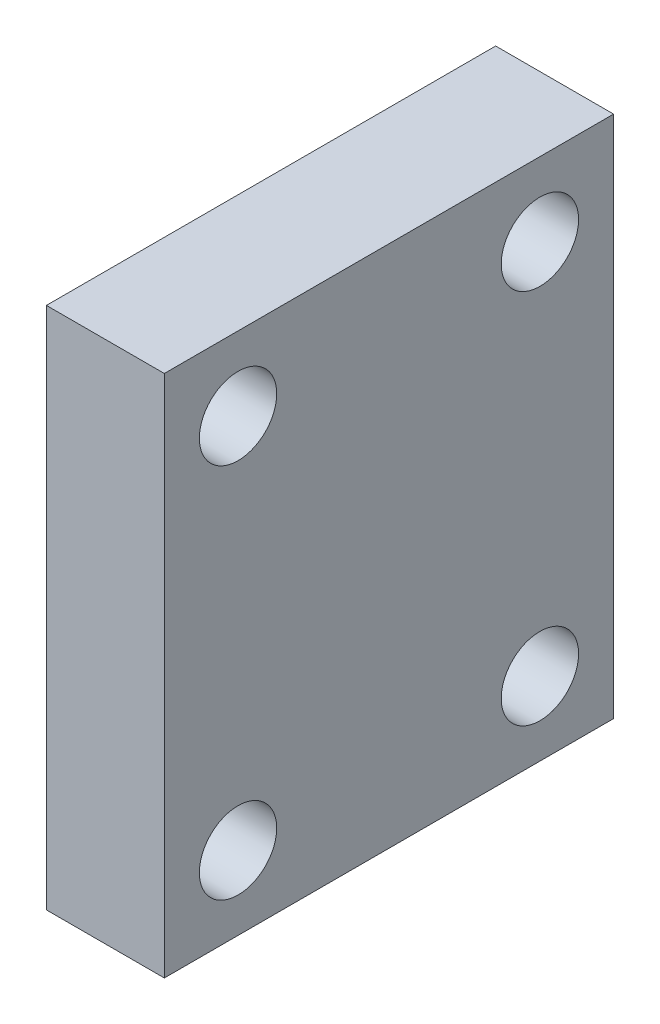
ISO-10303-21;
HEADER;
FILE_DESCRIPTION(('STEP AP214'),'2;1');
FILE_NAME('part.step','',(''),(''),'','','');
FILE_SCHEMA(('AUTOMOTIVE_DESIGN { 1 0 10303 214 1 1 1 1 }'));
ENDSEC;
DATA;
#1=APPLICATION_CONTEXT('core data for automotive mechanical design processes');
#2=APPLICATION_PROTOCOL_DEFINITION('international standard','automotive_design',2000,#1);
#3=PRODUCT_CONTEXT('',#1,'mechanical');
#4=PRODUCT('Part','Part','',(#3));
#5=PRODUCT_RELATED_PRODUCT_CATEGORY('part','',(#4));
#6=PRODUCT_DEFINITION_FORMATION('','',#4);
#7=PRODUCT_DEFINITION_CONTEXT('part definition',#1,'design');
#8=PRODUCT_DEFINITION('design','',#6,#7);
#9=PRODUCT_DEFINITION_SHAPE('','',#8);
#10=(LENGTH_UNIT() NAMED_UNIT(*) SI_UNIT(.MILLI.,.METRE.));
#11=(NAMED_UNIT(*) PLANE_ANGLE_UNIT() SI_UNIT($,.RADIAN.));
#12=(NAMED_UNIT(*) SI_UNIT($,.STERADIAN.) SOLID_ANGLE_UNIT());
#13=UNCERTAINTY_MEASURE_WITH_UNIT(LENGTH_MEASURE(1.E-05),#10,'distance_accuracy_value','');
#14=(GEOMETRIC_REPRESENTATION_CONTEXT(3) GLOBAL_UNCERTAINTY_ASSIGNED_CONTEXT((#13)) GLOBAL_UNIT_ASSIGNED_CONTEXT((#10,
#11,#12)) REPRESENTATION_CONTEXT('',''));
#15=CARTESIAN_POINT('',(0.,0.,0.));
#16=DIRECTION('',(0.,0.,1.));
#17=DIRECTION('',(1.,0.,0.));
#18=AXIS2_PLACEMENT_3D('',#15,#16,#17);
#19=CARTESIAN_POINT('',(12.7,74.549,48.387));
#20=DIRECTION('',(-1.,0.,0.));
#21=DIRECTION('',(0.,0.,1.));
#22=AXIS2_PLACEMENT_3D('',#19,#20,#21);
#23=CYLINDRICAL_SURFACE('',#22,11.509375);
#24=CARTESIAN_POINT('',(2.8194,74.549,48.387));
#25=DIRECTION('',(1.,0.,0.));
#26=DIRECTION('',(0.,0.,-1.));
#27=AXIS2_PLACEMENT_3D('',#24,#25,#26);
#28=CIRCLE('',#27,11.509375);
#29=CARTESIAN_POINT('',(2.8194,71.8767199958881,37.1921515208892));
#30=VERTEX_POINT('',#29);
#31=CARTESIAN_POINT('',(2.8194,79.375,37.9382949658522));
#32=VERTEX_POINT('',#31);
#33=EDGE_CURVE('E61',#30,#32,#28,.T.);
#34=ORIENTED_EDGE('',*,*,#33,.F.);
#35=DIRECTION('',(-1.,0.,0.));
#36=VECTOR('',#35,1.);
#37=CARTESIAN_POINT('',(1.4097,71.8767199958881,37.1921515208892));
#38=LINE('',#37,#36);
#39=CARTESIAN_POINT('',(0.,71.8767199958881,37.1921515208892));
#40=VERTEX_POINT('',#39);
#41=EDGE_CURVE('E138',#30,#40,#38,.T.);
#42=ORIENTED_EDGE('',*,*,#41,.T.);
#43=CARTESIAN_POINT('',(0.,74.549,48.387));
#44=DIRECTION('',(1.,0.,0.));
#45=DIRECTION('',(0.,0.,-1.));
#46=AXIS2_PLACEMENT_3D('',#43,#44,#45);
#47=CIRCLE('',#46,11.509375);
#48=CARTESIAN_POINT('',(0.,71.8767199958881,59.5818484791108));
#49=VERTEX_POINT('',#48);
#50=EDGE_CURVE('E144',#49,#40,#47,.T.);
#51=ORIENTED_EDGE('',*,*,#50,.F.);
#52=DIRECTION('',(-1.,0.,0.));
#53=VECTOR('',#52,1.);
#54=CARTESIAN_POINT('',(1.4097,71.8767199958881,59.5818484791108));
#55=LINE('',#54,#53);
#56=CARTESIAN_POINT('',(2.8194,71.8767199958881,59.5818484791108));
#57=VERTEX_POINT('',#56);
#58=EDGE_CURVE('E129',#49,#57,#55,.F.);
#59=ORIENTED_EDGE('',*,*,#58,.T.);
#60=CARTESIAN_POINT('',(2.8194,79.375,58.8357050341478));
#61=VERTEX_POINT('',#60);
#62=EDGE_CURVE('E212',#61,#57,#28,.T.);
#63=ORIENTED_EDGE('',*,*,#62,.F.);
#64=DIRECTION('',(-1.,0.,0.));
#65=VECTOR('',#64,1.);
#66=CARTESIAN_POINT('',(6.35,79.375,58.8357050341478));
#67=LINE('',#66,#65);
#68=CARTESIAN_POINT('',(12.7,79.375,58.8357050341478));
#69=VERTEX_POINT('',#68);
#70=EDGE_CURVE('E217',#61,#69,#67,.F.);
#71=ORIENTED_EDGE('',*,*,#70,.T.);
#72=CARTESIAN_POINT('',(12.7,74.549,48.387));
#73=DIRECTION('',(1.,0.,0.));
#74=DIRECTION('',(0.,0.,-1.));
#75=AXIS2_PLACEMENT_3D('',#72,#73,#74);
#76=CIRCLE('',#75,11.509375);
#77=CARTESIAN_POINT('',(12.7,79.375,37.9382949658522));
#78=VERTEX_POINT('',#77);
#79=EDGE_CURVE('E148',#69,#78,#76,.T.);
#80=ORIENTED_EDGE('',*,*,#79,.T.);
#81=DIRECTION('',(-1.,0.,0.));
#82=VECTOR('',#81,1.);
#83=CARTESIAN_POINT('',(6.35,79.375,37.9382949658522));
#84=LINE('',#83,#82);
#85=EDGE_CURVE('E154',#78,#32,#84,.T.);
#86=ORIENTED_EDGE('',*,*,#85,.T.);
#87=EDGE_LOOP('',(#34,#42,#51,#59,#63,#71,#80,#86));
#88=FACE_BOUND('',#87,.T.);
#89=ADVANCED_FACE('F39',(#88),#23,.F.);
#90=CARTESIAN_POINT('',(12.7,28.575,48.387));
#91=DIRECTION('',(-1.,0.,0.));
#92=DIRECTION('',(0.,0.,1.));
#93=AXIS2_PLACEMENT_3D('',#90,#91,#92);
#94=CYLINDRICAL_SURFACE('',#93,11.509375);
#95=CARTESIAN_POINT('',(2.8194,28.575,48.387));
#96=DIRECTION('',(1.,0.,0.));
#97=DIRECTION('',(0.,0.,-1.));
#98=AXIS2_PLACEMENT_3D('',#95,#96,#97);
#99=CIRCLE('',#98,11.509375);
#100=CARTESIAN_POINT('',(2.8194,25.9027199958881,37.1921515208892));
#101=VERTEX_POINT('',#100);
#102=CARTESIAN_POINT('',(2.8194,33.401,37.9382949658522));
#103=VERTEX_POINT('',#102);
#104=EDGE_CURVE('E53',#101,#103,#99,.T.);
#105=ORIENTED_EDGE('',*,*,#104,.F.);
#106=DIRECTION('',(-1.,0.,0.));
#107=VECTOR('',#106,1.);
#108=CARTESIAN_POINT('',(1.4097,25.9027199958881,37.1921515208892));
#109=LINE('',#108,#107);
#110=CARTESIAN_POINT('',(0.,25.9027199958881,37.1921515208892));
#111=VERTEX_POINT('',#110);
#112=EDGE_CURVE('E256',#101,#111,#109,.T.);
#113=ORIENTED_EDGE('',*,*,#112,.T.);
#114=CARTESIAN_POINT('',(0.,28.575,48.387));
#115=DIRECTION('',(1.,0.,0.));
#116=DIRECTION('',(0.,0.,-1.));
#117=AXIS2_PLACEMENT_3D('',#114,#115,#116);
#118=CIRCLE('',#117,11.509375);
#119=CARTESIAN_POINT('',(0.,25.9027199958881,59.5818484791108));
#120=VERTEX_POINT('',#119);
#121=EDGE_CURVE('E147',#120,#111,#118,.T.);
#122=ORIENTED_EDGE('',*,*,#121,.F.);
#123=DIRECTION('',(-1.,0.,0.));
#124=VECTOR('',#123,1.);
#125=CARTESIAN_POINT('',(1.4097,25.9027199958881,59.5818484791108));
#126=LINE('',#125,#124);
#127=CARTESIAN_POINT('',(2.8194,25.9027199958881,59.5818484791108));
#128=VERTEX_POINT('',#127);
#129=EDGE_CURVE('E250',#120,#128,#126,.F.);
#130=ORIENTED_EDGE('',*,*,#129,.T.);
#131=CARTESIAN_POINT('',(2.8194,33.401,58.8357050341478));
#132=VERTEX_POINT('',#131);
#133=EDGE_CURVE('E246',#132,#128,#99,.T.);
#134=ORIENTED_EDGE('',*,*,#133,.F.);
#135=DIRECTION('',(-1.,0.,0.));
#136=VECTOR('',#135,1.);
#137=CARTESIAN_POINT('',(6.35,33.401,58.8357050341478));
#138=LINE('',#137,#136);
#139=CARTESIAN_POINT('',(12.7,33.401,58.8357050341478));
#140=VERTEX_POINT('',#139);
#141=EDGE_CURVE('E228',#132,#140,#138,.F.);
#142=ORIENTED_EDGE('',*,*,#141,.T.);
#143=CARTESIAN_POINT('',(12.7,28.575,48.387));
#144=DIRECTION('',(1.,0.,0.));
#145=DIRECTION('',(0.,0.,-1.));
#146=AXIS2_PLACEMENT_3D('',#143,#144,#145);
#147=CIRCLE('',#146,11.509375);
#148=CARTESIAN_POINT('',(12.7,33.401,37.9382949658522));
#149=VERTEX_POINT('',#148);
#150=EDGE_CURVE('E151',#140,#149,#147,.T.);
#151=ORIENTED_EDGE('',*,*,#150,.T.);
#152=DIRECTION('',(-1.,0.,0.));
#153=VECTOR('',#152,1.);
#154=CARTESIAN_POINT('',(6.35,33.401,37.9382949658522));
#155=LINE('',#154,#153);
#156=EDGE_CURVE('E224',#149,#103,#155,.T.);
#157=ORIENTED_EDGE('',*,*,#156,.T.);
#158=EDGE_LOOP('',(#105,#113,#122,#130,#134,#142,#151,#157));
#159=FACE_BOUND('',#158,.T.);
#160=ADVANCED_FACE('F234',(#159),#94,.F.);
#161=CARTESIAN_POINT('',(25.4,0.,0.));
#162=DIRECTION('',(0.,1.,0.));
#163=DIRECTION('',(0.,0.,1.));
#164=AXIS2_PLACEMENT_3D('',#161,#162,#163);
#165=PLANE('',#164);
#166=DIRECTION('',(0.,0.,-1.));
#167=VECTOR('',#166,1.);
#168=CARTESIAN_POINT('',(0.,0.,0.));
#169=LINE('',#168,#167);
#170=CARTESIAN_POINT('',(0.,0.,96.774));
#171=VERTEX_POINT('',#170);
#172=CARTESIAN_POINT('',(0.,0.,0.));
#173=VERTEX_POINT('',#172);
#174=EDGE_CURVE('E180',#171,#173,#169,.T.);
#175=ORIENTED_EDGE('',*,*,#174,.T.);
#176=DIRECTION('',(-1.,0.,0.));
#177=VECTOR('',#176,1.);
#178=CARTESIAN_POINT('',(25.4,0.,0.));
#179=LINE('',#178,#177);
#180=CARTESIAN_POINT('',(25.4,0.,0.));
#181=VERTEX_POINT('',#180);
#182=EDGE_CURVE('E209',#181,#173,#179,.T.);
#183=ORIENTED_EDGE('',*,*,#182,.F.);
#184=DIRECTION('',(0.,0.,-1.));
#185=VECTOR('',#184,1.);
#186=CARTESIAN_POINT('',(25.4,0.,0.));
#187=LINE('',#186,#185);
#188=CARTESIAN_POINT('',(25.4,0.,96.774));
#189=VERTEX_POINT('',#188);
#190=EDGE_CURVE('E183',#189,#181,#187,.T.);
#191=ORIENTED_EDGE('',*,*,#190,.F.);
#192=DIRECTION('',(-1.,0.,0.));
#193=VECTOR('',#192,1.);
#194=CARTESIAN_POINT('',(25.4,0.,96.774));
#195=LINE('',#194,#193);
#196=EDGE_CURVE('E193',#189,#171,#195,.T.);
#197=ORIENTED_EDGE('',*,*,#196,.T.);
#198=EDGE_LOOP('',(#175,#183,#191,#197));
#199=FACE_BOUND('',#198,.T.);
#200=ADVANCED_FACE('F41',(#199),#165,.F.);
#201=CARTESIAN_POINT('',(25.4,0.,0.));
#202=DIRECTION('',(0.,0.,1.));
#203=DIRECTION('',(1.,0.,0.));
#204=AXIS2_PLACEMENT_3D('',#201,#202,#203);
#205=PLANE('',#204);
#206=DIRECTION('',(0.,1.,0.));
#207=VECTOR('',#206,1.);
#208=CARTESIAN_POINT('',(0.,0.,0.));
#209=LINE('',#208,#207);
#210=CARTESIAN_POINT('',(0.,112.776,0.));
#211=VERTEX_POINT('',#210);
#212=EDGE_CURVE('E196',#173,#211,#209,.T.);
#213=ORIENTED_EDGE('',*,*,#212,.T.);
#214=DIRECTION('',(-1.,0.,0.));
#215=VECTOR('',#214,1.);
#216=CARTESIAN_POINT('',(25.4,112.776,0.));
#217=LINE('',#216,#215);
#218=CARTESIAN_POINT('',(25.4,112.776,0.));
#219=VERTEX_POINT('',#218);
#220=EDGE_CURVE('E206',#219,#211,#217,.T.);
#221=ORIENTED_EDGE('',*,*,#220,.F.);
#222=DIRECTION('',(0.,1.,0.));
#223=VECTOR('',#222,1.);
#224=CARTESIAN_POINT('',(25.4,0.,0.));
#225=LINE('',#224,#223);
#226=EDGE_CURVE('E186',#181,#219,#225,.T.);
#227=ORIENTED_EDGE('',*,*,#226,.F.);
#228=ORIENTED_EDGE('',*,*,#182,.T.);
#229=EDGE_LOOP('',(#213,#221,#227,#228));
#230=FACE_BOUND('',#229,.T.);
#231=ADVANCED_FACE('F356',(#230),#205,.F.);
#232=CARTESIAN_POINT('',(25.4,112.776,0.));
#233=DIRECTION('',(0.,-1.,0.));
#234=DIRECTION('',(0.,0.,-1.));
#235=AXIS2_PLACEMENT_3D('',#232,#233,#234);
#236=PLANE('',#235);
#237=DIRECTION('',(0.,0.,1.));
#238=VECTOR('',#237,1.);
#239=CARTESIAN_POINT('',(0.,112.776,0.));
#240=LINE('',#239,#238);
#241=CARTESIAN_POINT('',(0.,112.776,96.774));
#242=VERTEX_POINT('',#241);
#243=EDGE_CURVE('E198',#211,#242,#240,.T.);
#244=ORIENTED_EDGE('',*,*,#243,.T.);
#245=DIRECTION('',(-1.,0.,0.));
#246=VECTOR('',#245,1.);
#247=CARTESIAN_POINT('',(25.4,112.776,96.774));
#248=LINE('',#247,#246);
#249=CARTESIAN_POINT('',(25.4,112.776,96.774));
#250=VERTEX_POINT('',#249);
#251=EDGE_CURVE('E203',#250,#242,#248,.T.);
#252=ORIENTED_EDGE('',*,*,#251,.F.);
#253=DIRECTION('',(0.,0.,1.));
#254=VECTOR('',#253,1.);
#255=CARTESIAN_POINT('',(25.4,112.776,0.));
#256=LINE('',#255,#254);
#257=EDGE_CURVE('E189',#219,#250,#256,.T.);
#258=ORIENTED_EDGE('',*,*,#257,.F.);
#259=ORIENTED_EDGE('',*,*,#220,.T.);
#260=EDGE_LOOP('',(#244,#252,#258,#259));
#261=FACE_BOUND('',#260,.T.);
#262=ADVANCED_FACE('F353',(#261),#236,.F.);
#263=CARTESIAN_POINT('',(25.4,0.,96.774));
#264=DIRECTION('',(0.,0.,-1.));
#265=DIRECTION('',(-1.,0.,0.));
#266=AXIS2_PLACEMENT_3D('',#263,#264,#265);
#267=PLANE('',#266);
#268=DIRECTION('',(0.,-1.,0.));
#269=VECTOR('',#268,1.);
#270=CARTESIAN_POINT('',(0.,0.,96.774));
#271=LINE('',#270,#269);
#272=EDGE_CURVE('E187',#242,#171,#271,.T.);
#273=ORIENTED_EDGE('',*,*,#272,.T.);
#274=ORIENTED_EDGE('',*,*,#196,.F.);
#275=DIRECTION('',(0.,-1.,0.));
#276=VECTOR('',#275,1.);
#277=CARTESIAN_POINT('',(25.4,0.,96.774));
#278=LINE('',#277,#276);
#279=EDGE_CURVE('E191',#250,#189,#278,.T.);
#280=ORIENTED_EDGE('',*,*,#279,.F.);
#281=ORIENTED_EDGE('',*,*,#251,.T.);
#282=EDGE_LOOP('',(#273,#274,#280,#281));
#283=FACE_BOUND('',#282,.T.);
#284=ADVANCED_FACE('F346',(#283),#267,.F.);
#285=CARTESIAN_POINT('',(25.4,0.,0.));
#286=DIRECTION('',(-1.,0.,0.));
#287=DIRECTION('',(0.,0.,1.));
#288=AXIS2_PLACEMENT_3D('',#285,#286,#287);
#289=PLANE('',#288);
#290=CARTESIAN_POINT('',(25.4,96.901,15.875));
#291=DIRECTION('',(1.,0.,0.));
#292=DIRECTION('',(0.,0.,-1.));
#293=AXIS2_PLACEMENT_3D('',#290,#291,#292);
#294=CIRCLE('',#293,8.334375);
#295=CARTESIAN_POINT('',(25.4,96.901,7.540625));
#296=VERTEX_POINT('',#295);
#297=EDGE_CURVE('E169',#296,#296,#294,.T.);
#298=ORIENTED_EDGE('',*,*,#297,.F.);
#299=EDGE_LOOP('',(#298));
#300=FACE_BOUND('',#299,.T.);
#301=CARTESIAN_POINT('',(25.4,15.875,80.899));
#302=DIRECTION('',(1.,0.,0.));
#303=DIRECTION('',(0.,0.,-1.));
#304=AXIS2_PLACEMENT_3D('',#301,#302,#303);
#305=CIRCLE('',#304,8.334375);
#306=CARTESIAN_POINT('',(25.4,15.875,72.564625));
#307=VERTEX_POINT('',#306);
#308=EDGE_CURVE('E161',#307,#307,#305,.T.);
#309=ORIENTED_EDGE('',*,*,#308,.F.);
#310=EDGE_LOOP('',(#309));
#311=FACE_BOUND('',#310,.T.);
#312=CARTESIAN_POINT('',(25.4,96.901,80.899));
#313=DIRECTION('',(1.,0.,0.));
#314=DIRECTION('',(0.,0.,-1.));
#315=AXIS2_PLACEMENT_3D('',#312,#313,#314);
#316=CIRCLE('',#315,8.33437500000001);
#317=CARTESIAN_POINT('',(25.4,96.901,72.564625));
#318=VERTEX_POINT('',#317);
#319=EDGE_CURVE('E162',#318,#318,#316,.T.);
#320=ORIENTED_EDGE('',*,*,#319,.F.);
#321=EDGE_LOOP('',(#320));
#322=FACE_BOUND('',#321,.T.);
#323=CARTESIAN_POINT('',(25.4,15.875,15.875));
#324=DIRECTION('',(1.,0.,0.));
#325=DIRECTION('',(0.,0.,-1.));
#326=AXIS2_PLACEMENT_3D('',#323,#324,#325);
#327=CIRCLE('',#326,8.334375);
#328=CARTESIAN_POINT('',(25.4,15.875,7.540625));
#329=VERTEX_POINT('',#328);
#330=EDGE_CURVE('E177',#329,#329,#327,.T.);
#331=ORIENTED_EDGE('',*,*,#330,.F.);
#332=EDGE_LOOP('',(#331));
#333=FACE_BOUND('',#332,.T.);
#334=ORIENTED_EDGE('',*,*,#190,.T.);
#335=ORIENTED_EDGE('',*,*,#226,.T.);
#336=ORIENTED_EDGE('',*,*,#257,.T.);
#337=ORIENTED_EDGE('',*,*,#279,.T.);
#338=EDGE_LOOP('',(#334,#335,#336,#337));
#339=FACE_BOUND('',#338,.T.);
#340=ADVANCED_FACE('F343',(#300,#311,#322,#333,#339),#289,.F.);
#341=CARTESIAN_POINT('',(0.,0.,0.));
#342=DIRECTION('',(-1.,0.,0.));
#343=DIRECTION('',(0.,0.,1.));
#344=AXIS2_PLACEMENT_3D('',#341,#342,#343);
#345=PLANE('',#344);
#346=CARTESIAN_POINT('',(0.,7.239,48.387));
#347=DIRECTION('',(1.,0.,0.));
#348=DIRECTION('',(0.,0.,-1.));
#349=AXIS2_PLACEMENT_3D('',#346,#347,#348);
#350=CIRCLE('',#349,3.175);
#351=CARTESIAN_POINT('',(0.,7.239,45.212));
#352=VERTEX_POINT('',#351);
#353=EDGE_CURVE('E285',#352,#352,#350,.T.);
#354=ORIENTED_EDGE('',*,*,#353,.T.);
#355=EDGE_LOOP('',(#354));
#356=FACE_BOUND('',#355,.T.);
#357=CARTESIAN_POINT('',(0.,56.261,80.899));
#358=DIRECTION('',(1.,0.,0.));
#359=DIRECTION('',(0.,0.,-1.));
#360=AXIS2_PLACEMENT_3D('',#357,#358,#359);
#361=CIRCLE('',#360,3.175);
#362=CARTESIAN_POINT('',(0.,56.261,77.724));
#363=VERTEX_POINT('',#362);
#364=EDGE_CURVE('E290',#363,#363,#361,.T.);
#365=ORIENTED_EDGE('',*,*,#364,.T.);
#366=EDGE_LOOP('',(#365));
#367=FACE_BOUND('',#366,.T.);
#368=CARTESIAN_POINT('',(0.,105.537,48.387));
#369=DIRECTION('',(1.,0.,0.));
#370=DIRECTION('',(0.,0.,-1.));
#371=AXIS2_PLACEMENT_3D('',#368,#369,#370);
#372=CIRCLE('',#371,3.57187500000001);
#373=CARTESIAN_POINT('',(0.,105.537,44.815125));
#374=VERTEX_POINT('',#373);
#375=EDGE_CURVE('E267',#374,#374,#372,.T.);
#376=ORIENTED_EDGE('',*,*,#375,.T.);
#377=EDGE_LOOP('',(#376));
#378=FACE_BOUND('',#377,.T.);
#379=CARTESIAN_POINT('',(0.,56.515,15.875));
#380=DIRECTION('',(1.,0.,0.));
#381=DIRECTION('',(0.,0.,-1.));
#382=AXIS2_PLACEMENT_3D('',#379,#380,#381);
#383=CIRCLE('',#382,3.571875);
#384=CARTESIAN_POINT('',(0.,56.515,12.303125));
#385=VERTEX_POINT('',#384);
#386=EDGE_CURVE('E272',#385,#385,#383,.T.);
#387=ORIENTED_EDGE('',*,*,#386,.T.);
#388=EDGE_LOOP('',(#387));
#389=FACE_BOUND('',#388,.T.);
#390=ORIENTED_EDGE('',*,*,#121,.T.);
#391=CARTESIAN_POINT('',(0.,38.227,48.387));
#392=DIRECTION('',(1.,0.,0.));
#393=DIRECTION('',(0.,0.,-1.));
#394=AXIS2_PLACEMENT_3D('',#391,#392,#393);
#395=CIRCLE('',#394,16.6497);
#396=EDGE_CURVE('E145',#111,#120,#395,.T.);
#397=ORIENTED_EDGE('',*,*,#396,.T.);
#398=EDGE_LOOP('',(#390,#397));
#399=FACE_BOUND('',#398,.T.);
#400=ORIENTED_EDGE('',*,*,#50,.T.);
#401=CARTESIAN_POINT('',(0.,84.201,48.387));
#402=DIRECTION('',(1.,0.,0.));
#403=DIRECTION('',(0.,0.,-1.));
#404=AXIS2_PLACEMENT_3D('',#401,#402,#403);
#405=CIRCLE('',#404,16.6497);
#406=EDGE_CURVE('E132',#40,#49,#405,.T.);
#407=ORIENTED_EDGE('',*,*,#406,.T.);
#408=EDGE_LOOP('',(#400,#407));
#409=FACE_BOUND('',#408,.T.);
#410=CARTESIAN_POINT('',(0.,96.901,15.875));
#411=DIRECTION('',(1.,0.,0.));
#412=DIRECTION('',(0.,0.,-1.));
#413=AXIS2_PLACEMENT_3D('',#410,#411,#412);
#414=CIRCLE('',#413,8.334375);
#415=CARTESIAN_POINT('',(0.,96.901,7.540625));
#416=VERTEX_POINT('',#415);
#417=EDGE_CURVE('E165',#416,#416,#414,.T.);
#418=ORIENTED_EDGE('',*,*,#417,.T.);
#419=EDGE_LOOP('',(#418));
#420=FACE_BOUND('',#419,.T.);
#421=CARTESIAN_POINT('',(0.,15.875,80.899));
#422=DIRECTION('',(1.,0.,0.));
#423=DIRECTION('',(0.,0.,-1.));
#424=AXIS2_PLACEMENT_3D('',#421,#422,#423);
#425=CIRCLE('',#424,8.334375);
#426=CARTESIAN_POINT('',(0.,15.875,72.564625));
#427=VERTEX_POINT('',#426);
#428=EDGE_CURVE('E172',#427,#427,#425,.T.);
#429=ORIENTED_EDGE('',*,*,#428,.T.);
#430=EDGE_LOOP('',(#429));
#431=FACE_BOUND('',#430,.T.);
#432=CARTESIAN_POINT('',(0.,96.901,80.899));
#433=DIRECTION('',(1.,0.,0.));
#434=DIRECTION('',(0.,0.,-1.));
#435=AXIS2_PLACEMENT_3D('',#432,#433,#434);
#436=CIRCLE('',#435,8.33437500000001);
#437=CARTESIAN_POINT('',(0.,96.901,72.564625));
#438=VERTEX_POINT('',#437);
#439=EDGE_CURVE('E158',#438,#438,#436,.T.);
#440=ORIENTED_EDGE('',*,*,#439,.T.);
#441=EDGE_LOOP('',(#440));
#442=FACE_BOUND('',#441,.T.);
#443=CARTESIAN_POINT('',(0.,15.875,15.875));
#444=DIRECTION('',(1.,0.,0.));
#445=DIRECTION('',(0.,0.,-1.));
#446=AXIS2_PLACEMENT_3D('',#443,#444,#445);
#447=CIRCLE('',#446,8.334375);
#448=CARTESIAN_POINT('',(0.,15.875,7.540625));
#449=VERTEX_POINT('',#448);
#450=EDGE_CURVE('E168',#449,#449,#447,.T.);
#451=ORIENTED_EDGE('',*,*,#450,.T.);
#452=EDGE_LOOP('',(#451));
#453=FACE_BOUND('',#452,.T.);
#454=ORIENTED_EDGE('',*,*,#174,.F.);
#455=ORIENTED_EDGE('',*,*,#272,.F.);
#456=ORIENTED_EDGE('',*,*,#243,.F.);
#457=ORIENTED_EDGE('',*,*,#212,.F.);
#458=EDGE_LOOP('',(#454,#455,#456,#457));
#459=FACE_BOUND('',#458,.T.);
#460=ADVANCED_FACE('F142',(#356,#367,#378,#389,#399,#409,#420,#431,#442,#453,#459),#345,.T.);
#461=CARTESIAN_POINT('',(25.4,15.875,15.875));
#462=DIRECTION('',(-1.,0.,0.));
#463=DIRECTION('',(0.,0.,1.));
#464=AXIS2_PLACEMENT_3D('',#461,#462,#463);
#465=CYLINDRICAL_SURFACE('',#464,8.334375);
#466=ORIENTED_EDGE('',*,*,#330,.T.);
#467=EDGE_LOOP('',(#466));
#468=FACE_BOUND('',#467,.T.);
#469=ORIENTED_EDGE('',*,*,#450,.F.);
#470=EDGE_LOOP('',(#469));
#471=FACE_BOUND('',#470,.T.);
#472=ADVANCED_FACE('F332',(#468,#471),#465,.F.);
#473=CARTESIAN_POINT('',(25.4,96.901,80.899));
#474=DIRECTION('',(-1.,0.,0.));
#475=DIRECTION('',(0.,0.,1.));
#476=AXIS2_PLACEMENT_3D('',#473,#474,#475);
#477=CYLINDRICAL_SURFACE('',#476,8.33437500000001);
#478=ORIENTED_EDGE('',*,*,#319,.T.);
#479=EDGE_LOOP('',(#478));
#480=FACE_BOUND('',#479,.T.);
#481=ORIENTED_EDGE('',*,*,#439,.F.);
#482=EDGE_LOOP('',(#481));
#483=FACE_BOUND('',#482,.T.);
#484=ADVANCED_FACE('F328',(#480,#483),#477,.F.);
#485=CARTESIAN_POINT('',(25.4,15.875,80.899));
#486=DIRECTION('',(-1.,0.,0.));
#487=DIRECTION('',(0.,0.,1.));
#488=AXIS2_PLACEMENT_3D('',#485,#486,#487);
#489=CYLINDRICAL_SURFACE('',#488,8.334375);
#490=ORIENTED_EDGE('',*,*,#308,.T.);
#491=EDGE_LOOP('',(#490));
#492=FACE_BOUND('',#491,.T.);
#493=ORIENTED_EDGE('',*,*,#428,.F.);
#494=EDGE_LOOP('',(#493));
#495=FACE_BOUND('',#494,.T.);
#496=ADVANCED_FACE('F331',(#492,#495),#489,.F.);
#497=CARTESIAN_POINT('',(25.4,96.901,15.875));
#498=DIRECTION('',(-1.,0.,0.));
#499=DIRECTION('',(0.,0.,1.));
#500=AXIS2_PLACEMENT_3D('',#497,#498,#499);
#501=CYLINDRICAL_SURFACE('',#500,8.334375);
#502=ORIENTED_EDGE('',*,*,#297,.T.);
#503=EDGE_LOOP('',(#502));
#504=FACE_BOUND('',#503,.T.);
#505=ORIENTED_EDGE('',*,*,#417,.F.);
#506=EDGE_LOOP('',(#505));
#507=FACE_BOUND('',#506,.T.);
#508=ADVANCED_FACE('F326',(#504,#507),#501,.F.);
#509=CARTESIAN_POINT('',(12.7,74.549,48.387));
#510=DIRECTION('',(1.,0.,0.));
#511=DIRECTION('',(0.,0.,-1.));
#512=AXIS2_PLACEMENT_3D('',#509,#510,#511);
#513=PLANE('',#512);
#514=ORIENTED_EDGE('',*,*,#79,.F.);
#515=CARTESIAN_POINT('',(12.7,84.201,48.387));
#516=DIRECTION('',(1.,0.,0.));
#517=DIRECTION('',(0.,0.,-1.));
#518=AXIS2_PLACEMENT_3D('',#515,#516,#517);
#519=CIRCLE('',#518,11.509375);
#520=EDGE_CURVE('E222',#78,#69,#519,.T.);
#521=ORIENTED_EDGE('',*,*,#520,.F.);
#522=EDGE_LOOP('',(#514,#521));
#523=FACE_BOUND('',#522,.T.);
#524=ADVANCED_FACE('F323',(#523),#513,.F.);
#525=CARTESIAN_POINT('',(12.7,28.575,48.387));
#526=DIRECTION('',(1.,0.,0.));
#527=DIRECTION('',(0.,0.,-1.));
#528=AXIS2_PLACEMENT_3D('',#525,#526,#527);
#529=PLANE('',#528);
#530=ORIENTED_EDGE('',*,*,#150,.F.);
#531=CARTESIAN_POINT('',(12.7,38.227,48.387));
#532=DIRECTION('',(1.,0.,0.));
#533=DIRECTION('',(0.,0.,-1.));
#534=AXIS2_PLACEMENT_3D('',#531,#532,#533);
#535=CIRCLE('',#534,11.509375);
#536=EDGE_CURVE('E241',#149,#140,#535,.T.);
#537=ORIENTED_EDGE('',*,*,#536,.F.);
#538=EDGE_LOOP('',(#530,#537));
#539=FACE_BOUND('',#538,.T.);
#540=ADVANCED_FACE('F240',(#539),#529,.F.);
#541=CARTESIAN_POINT('',(12.7,38.227,48.387));
#542=DIRECTION('',(-1.,0.,0.));
#543=DIRECTION('',(0.,0.,1.));
#544=AXIS2_PLACEMENT_3D('',#541,#542,#543);
#545=CYLINDRICAL_SURFACE('',#544,11.509375);
#546=CARTESIAN_POINT('',(2.8194,38.227,48.387));
#547=DIRECTION('',(1.,0.,0.));
#548=DIRECTION('',(0.,0.,-1.));
#549=AXIS2_PLACEMENT_3D('',#546,#547,#548);
#550=CIRCLE('',#549,11.509375);
#551=EDGE_CURVE('E11',#103,#132,#550,.T.);
#552=ORIENTED_EDGE('',*,*,#551,.F.);
#553=ORIENTED_EDGE('',*,*,#156,.F.);
#554=ORIENTED_EDGE('',*,*,#536,.T.);
#555=ORIENTED_EDGE('',*,*,#141,.F.);
#556=EDGE_LOOP('',(#552,#553,#554,#555));
#557=FACE_BOUND('',#556,.T.);
#558=ADVANCED_FACE('F244',(#557),#545,.F.);
#559=CARTESIAN_POINT('',(12.7,84.201,48.387));
#560=DIRECTION('',(-1.,0.,0.));
#561=DIRECTION('',(0.,0.,1.));
#562=AXIS2_PLACEMENT_3D('',#559,#560,#561);
#563=CYLINDRICAL_SURFACE('',#562,11.509375);
#564=CARTESIAN_POINT('',(2.8194,84.201,48.387));
#565=DIRECTION('',(1.,0.,0.));
#566=DIRECTION('',(0.,0.,-1.));
#567=AXIS2_PLACEMENT_3D('',#564,#565,#566);
#568=CIRCLE('',#567,11.509375);
#569=EDGE_CURVE('E47',#32,#61,#568,.T.);
#570=ORIENTED_EDGE('',*,*,#569,.F.);
#571=ORIENTED_EDGE('',*,*,#85,.F.);
#572=ORIENTED_EDGE('',*,*,#520,.T.);
#573=ORIENTED_EDGE('',*,*,#70,.F.);
#574=EDGE_LOOP('',(#570,#571,#572,#573));
#575=FACE_BOUND('',#574,.T.);
#576=ADVANCED_FACE('F221',(#575),#563,.F.);
#577=CARTESIAN_POINT('',(2.8194,84.201,48.387));
#578=DIRECTION('',(-1.,0.,0.));
#579=DIRECTION('',(0.,0.,1.));
#580=AXIS2_PLACEMENT_3D('',#577,#578,#579);
#581=CYLINDRICAL_SURFACE('',#580,16.6497);
#582=CARTESIAN_POINT('',(2.8194,84.201,48.387));
#583=DIRECTION('',(1.,0.,0.));
#584=DIRECTION('',(0.,0.,-1.));
#585=AXIS2_PLACEMENT_3D('',#582,#583,#584);
#586=CIRCLE('',#585,16.6497);
#587=EDGE_CURVE('E134',#30,#57,#586,.T.);
#588=ORIENTED_EDGE('',*,*,#587,.T.);
#589=ORIENTED_EDGE('',*,*,#58,.F.);
#590=ORIENTED_EDGE('',*,*,#406,.F.);
#591=ORIENTED_EDGE('',*,*,#41,.F.);
#592=EDGE_LOOP('',(#588,#589,#590,#591));
#593=FACE_BOUND('',#592,.T.);
#594=ADVANCED_FACE('F131',(#593),#581,.F.);
#595=CARTESIAN_POINT('',(2.8194,84.201,48.387));
#596=DIRECTION('',(1.,0.,0.));
#597=DIRECTION('',(0.,0.,-1.));
#598=AXIS2_PLACEMENT_3D('',#595,#596,#597);
#599=PLANE('',#598);
#600=ORIENTED_EDGE('',*,*,#33,.T.);
#601=ORIENTED_EDGE('',*,*,#569,.T.);
#602=ORIENTED_EDGE('',*,*,#62,.T.);
#603=ORIENTED_EDGE('',*,*,#587,.F.);
#604=EDGE_LOOP('',(#600,#601,#602,#603));
#605=FACE_BOUND('',#604,.T.);
#606=ADVANCED_FACE('F211',(#605),#599,.F.);
#607=CARTESIAN_POINT('',(2.8194,38.227,48.387));
#608=DIRECTION('',(-1.,0.,0.));
#609=DIRECTION('',(0.,0.,1.));
#610=AXIS2_PLACEMENT_3D('',#607,#608,#609);
#611=CYLINDRICAL_SURFACE('',#610,16.6497);
#612=CARTESIAN_POINT('',(2.8194,38.227,48.387));
#613=DIRECTION('',(1.,0.,0.));
#614=DIRECTION('',(0.,0.,-1.));
#615=AXIS2_PLACEMENT_3D('',#612,#613,#614);
#616=CIRCLE('',#615,16.6497);
#617=EDGE_CURVE('E219',#101,#128,#616,.T.);
#618=ORIENTED_EDGE('',*,*,#617,.T.);
#619=ORIENTED_EDGE('',*,*,#129,.F.);
#620=ORIENTED_EDGE('',*,*,#396,.F.);
#621=ORIENTED_EDGE('',*,*,#112,.F.);
#622=EDGE_LOOP('',(#618,#619,#620,#621));
#623=FACE_BOUND('',#622,.T.);
#624=ADVANCED_FACE('F491',(#623),#611,.F.);
#625=CARTESIAN_POINT('',(2.8194,38.227,48.387));
#626=DIRECTION('',(1.,0.,0.));
#627=DIRECTION('',(0.,0.,-1.));
#628=AXIS2_PLACEMENT_3D('',#625,#626,#627);
#629=PLANE('',#628);
#630=ORIENTED_EDGE('',*,*,#104,.T.);
#631=ORIENTED_EDGE('',*,*,#551,.T.);
#632=ORIENTED_EDGE('',*,*,#133,.T.);
#633=ORIENTED_EDGE('',*,*,#617,.F.);
#634=EDGE_LOOP('',(#630,#631,#632,#633));
#635=FACE_BOUND('',#634,.T.);
#636=ADVANCED_FACE('F245',(#635),#629,.F.);
#637=CARTESIAN_POINT('',(7.874,56.515,15.875));
#638=DIRECTION('',(-1.,0.,0.));
#639=DIRECTION('',(0.,0.,1.));
#640=AXIS2_PLACEMENT_3D('',#637,#638,#639);
#641=CYLINDRICAL_SURFACE('',#640,3.571875);
#642=CARTESIAN_POINT('',(7.874,56.515,15.875));
#643=DIRECTION('',(1.,0.,0.));
#644=DIRECTION('',(0.,0.,-1.));
#645=AXIS2_PLACEMENT_3D('',#642,#643,#644);
#646=CIRCLE('',#645,3.571875);
#647=CARTESIAN_POINT('',(7.874,56.515,12.303125));
#648=VERTEX_POINT('',#647);
#649=EDGE_CURVE('E279',#648,#648,#646,.T.);
#650=ORIENTED_EDGE('',*,*,#649,.T.);
#651=EDGE_LOOP('',(#650));
#652=FACE_BOUND('',#651,.T.);
#653=ORIENTED_EDGE('',*,*,#386,.F.);
#654=EDGE_LOOP('',(#653));
#655=FACE_BOUND('',#654,.T.);
#656=ADVANCED_FACE('F508',(#652,#655),#641,.F.);
#657=CARTESIAN_POINT('',(7.874,56.515,15.875));
#658=DIRECTION('',(1.,0.,0.));
#659=DIRECTION('',(0.,0.,-1.));
#660=AXIS2_PLACEMENT_3D('',#657,#658,#659);
#661=PLANE('',#660);
#662=ORIENTED_EDGE('',*,*,#649,.F.);
#663=EDGE_LOOP('',(#662));
#664=FACE_BOUND('',#663,.T.);
#665=ADVANCED_FACE('F517',(#664),#661,.F.);
#666=CARTESIAN_POINT('',(7.874,105.537,48.387));
#667=DIRECTION('',(-1.,0.,0.));
#668=DIRECTION('',(0.,0.,1.));
#669=AXIS2_PLACEMENT_3D('',#666,#667,#668);
#670=CYLINDRICAL_SURFACE('',#669,3.57187500000001);
#671=CARTESIAN_POINT('',(7.874,105.537,48.387));
#672=DIRECTION('',(1.,0.,0.));
#673=DIRECTION('',(0.,0.,-1.));
#674=AXIS2_PLACEMENT_3D('',#671,#672,#673);
#675=CIRCLE('',#674,3.57187500000001);
#676=CARTESIAN_POINT('',(7.874,105.537,44.815125));
#677=VERTEX_POINT('',#676);
#678=EDGE_CURVE('E265',#677,#677,#675,.T.);
#679=ORIENTED_EDGE('',*,*,#678,.T.);
#680=EDGE_LOOP('',(#679));
#681=FACE_BOUND('',#680,.T.);
#682=ORIENTED_EDGE('',*,*,#375,.F.);
#683=EDGE_LOOP('',(#682));
#684=FACE_BOUND('',#683,.T.);
#685=ADVANCED_FACE('F526',(#681,#684),#670,.F.);
#686=CARTESIAN_POINT('',(7.874,105.537,48.387));
#687=DIRECTION('',(1.,0.,0.));
#688=DIRECTION('',(0.,0.,-1.));
#689=AXIS2_PLACEMENT_3D('',#686,#687,#688);
#690=PLANE('',#689);
#691=ORIENTED_EDGE('',*,*,#678,.F.);
#692=EDGE_LOOP('',(#691));
#693=FACE_BOUND('',#692,.T.);
#694=ADVANCED_FACE('F311',(#693),#690,.F.);
#695=CARTESIAN_POINT('',(7.874,56.261,80.899));
#696=DIRECTION('',(-1.,0.,0.));
#697=DIRECTION('',(0.,0.,1.));
#698=AXIS2_PLACEMENT_3D('',#695,#696,#697);
#699=CYLINDRICAL_SURFACE('',#698,3.175);
#700=CARTESIAN_POINT('',(7.874,56.261,80.899));
#701=DIRECTION('',(1.,0.,0.));
#702=DIRECTION('',(0.,0.,-1.));
#703=AXIS2_PLACEMENT_3D('',#700,#701,#702);
#704=CIRCLE('',#703,3.175);
#705=CARTESIAN_POINT('',(7.874,56.261,77.724));
#706=VERTEX_POINT('',#705);
#707=EDGE_CURVE('E275',#706,#706,#704,.T.);
#708=ORIENTED_EDGE('',*,*,#707,.T.);
#709=EDGE_LOOP('',(#708));
#710=FACE_BOUND('',#709,.T.);
#711=ORIENTED_EDGE('',*,*,#364,.F.);
#712=EDGE_LOOP('',(#711));
#713=FACE_BOUND('',#712,.T.);
#714=ADVANCED_FACE('F298',(#710,#713),#699,.F.);
#715=CARTESIAN_POINT('',(7.874,56.261,80.899));
#716=DIRECTION('',(1.,0.,0.));
#717=DIRECTION('',(0.,0.,-1.));
#718=AXIS2_PLACEMENT_3D('',#715,#716,#717);
#719=PLANE('',#718);
#720=ORIENTED_EDGE('',*,*,#707,.F.);
#721=EDGE_LOOP('',(#720));
#722=FACE_BOUND('',#721,.T.);
#723=ADVANCED_FACE('F301',(#722),#719,.F.);
#724=CARTESIAN_POINT('',(7.874,7.239,48.387));
#725=DIRECTION('',(-1.,0.,0.));
#726=DIRECTION('',(0.,0.,1.));
#727=AXIS2_PLACEMENT_3D('',#724,#725,#726);
#728=CYLINDRICAL_SURFACE('',#727,3.175);
#729=CARTESIAN_POINT('',(7.874,7.239,48.387));
#730=DIRECTION('',(1.,0.,0.));
#731=DIRECTION('',(0.,0.,-1.));
#732=AXIS2_PLACEMENT_3D('',#729,#730,#731);
#733=CIRCLE('',#732,3.175);
#734=CARTESIAN_POINT('',(7.874,7.239,45.212));
#735=VERTEX_POINT('',#734);
#736=EDGE_CURVE('E281',#735,#735,#733,.T.);
#737=ORIENTED_EDGE('',*,*,#736,.T.);
#738=EDGE_LOOP('',(#737));
#739=FACE_BOUND('',#738,.T.);
#740=ORIENTED_EDGE('',*,*,#353,.F.);
#741=EDGE_LOOP('',(#740));
#742=FACE_BOUND('',#741,.T.);
#743=ADVANCED_FACE('F303',(#739,#742),#728,.F.);
#744=CARTESIAN_POINT('',(7.874,7.239,48.387));
#745=DIRECTION('',(1.,0.,0.));
#746=DIRECTION('',(0.,0.,-1.));
#747=AXIS2_PLACEMENT_3D('',#744,#745,#746);
#748=PLANE('',#747);
#749=ORIENTED_EDGE('',*,*,#736,.F.);
#750=EDGE_LOOP('',(#749));
#751=FACE_BOUND('',#750,.T.);
#752=ADVANCED_FACE('F309',(#751),#748,.F.);
#753=CLOSED_SHELL('',(#89,#160,#200,#231,#262,#284,#340,#460,#472,#484,#496,#508,#524,#540,#558,
#576,#594,#606,#624,#636,#656,#665,#685,#694,#714,#723,#743,#752));
#754=MANIFOLD_SOLID_BREP('B2',#753);
#755=ADVANCED_BREP_SHAPE_REPRESENTATION('',(#18,#754),#14);
#756=SHAPE_DEFINITION_REPRESENTATION(#9,#755);
ENDSEC;
END-ISO-10303-21;
